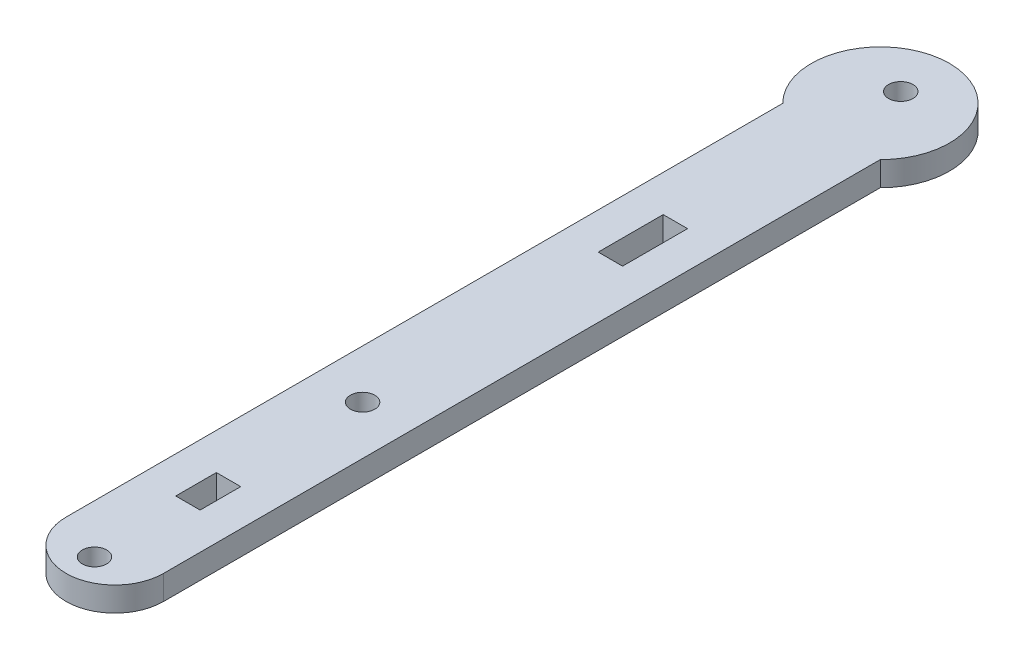
ISO-10303-21;
HEADER;
FILE_DESCRIPTION(('STEP AP214'),'2;1');
FILE_NAME('part.step','',(''),(''),'','','');
FILE_SCHEMA(('AUTOMOTIVE_DESIGN { 1 0 10303 214 1 1 1 1 }'));
ENDSEC;
DATA;
#1=APPLICATION_CONTEXT('core data for automotive mechanical design processes');
#2=APPLICATION_PROTOCOL_DEFINITION('international standard','automotive_design',2000,#1);
#3=PRODUCT_CONTEXT('',#1,'mechanical');
#4=PRODUCT('Part','Part','',(#3));
#5=PRODUCT_RELATED_PRODUCT_CATEGORY('part','',(#4));
#6=PRODUCT_DEFINITION_FORMATION('','',#4);
#7=PRODUCT_DEFINITION_CONTEXT('part definition',#1,'design');
#8=PRODUCT_DEFINITION('design','',#6,#7);
#9=PRODUCT_DEFINITION_SHAPE('','',#8);
#10=(LENGTH_UNIT() NAMED_UNIT(*) SI_UNIT(.MILLI.,.METRE.));
#11=(NAMED_UNIT(*) PLANE_ANGLE_UNIT() SI_UNIT($,.RADIAN.));
#12=(NAMED_UNIT(*) SI_UNIT($,.STERADIAN.) SOLID_ANGLE_UNIT());
#13=UNCERTAINTY_MEASURE_WITH_UNIT(LENGTH_MEASURE(1.E-05),#10,'distance_accuracy_value','');
#14=(GEOMETRIC_REPRESENTATION_CONTEXT(3) GLOBAL_UNCERTAINTY_ASSIGNED_CONTEXT((#13)) GLOBAL_UNIT_ASSIGNED_CONTEXT((#10,
#11,#12)) REPRESENTATION_CONTEXT('',''));
#15=CARTESIAN_POINT('',(0.,0.,0.));
#16=DIRECTION('',(0.,0.,1.));
#17=DIRECTION('',(1.,0.,0.));
#18=AXIS2_PLACEMENT_3D('',#15,#16,#17);
#19=CARTESIAN_POINT('',(41801.1732579615,-384.569309846236,49.8701856440254));
#20=DIRECTION('',(0.,1.,0.));
#21=DIRECTION('',(1.,0.,0.));
#22=AXIS2_PLACEMENT_3D('',#19,#20,#21);
#23=PLANE('',#22);
#24=CARTESIAN_POINT('',(41801.1732579615,-384.569309846236,19.3701856440254));
#25=DIRECTION('',(0.,1.,0.));
#26=DIRECTION('',(1.,0.,0.));
#27=AXIS2_PLACEMENT_3D('',#24,#25,#26);
#28=CIRCLE('',#27,1.50000000000178);
#29=CARTESIAN_POINT('',(41802.6732579615,-384.569309846236,19.3701856440254));
#30=VERTEX_POINT('',#29);
#31=EDGE_CURVE('E169',#30,#30,#28,.T.);
#32=ORIENTED_EDGE('',*,*,#31,.F.);
#33=EDGE_LOOP('',(#32));
#34=FACE_BOUND('',#33,.T.);
#35=CARTESIAN_POINT('',(41801.1732579615,-384.569309846236,49.8701856440254));
#36=DIRECTION('',(0.,1.,0.));
#37=DIRECTION('',(1.,0.,0.));
#38=AXIS2_PLACEMENT_3D('',#35,#36,#37);
#39=CIRCLE('',#38,6.00000000000023);
#40=CARTESIAN_POINT('',(41795.1732579615,-384.569309846236,49.8701856440254));
#41=VERTEX_POINT('',#40);
#42=CARTESIAN_POINT('',(41807.1732579615,-384.569309846236,49.8701856440254));
#43=VERTEX_POINT('',#42);
#44=EDGE_CURVE('E212',#41,#43,#39,.T.);
#45=ORIENTED_EDGE('',*,*,#44,.T.);
#46=DIRECTION('',(0.,0.,-1.));
#47=VECTOR('',#46,1.);
#48=CARTESIAN_POINT('',(41807.1732579615,-384.569309846236,49.8701856440254));
#49=LINE('',#48,#47);
#50=CARTESIAN_POINT('',(41807.1732579615,-384.569309846237,-38.3493883546306));
#51=VERTEX_POINT('',#50);
#52=EDGE_CURVE('E215',#43,#51,#49,.T.);
#53=ORIENTED_EDGE('',*,*,#52,.T.);
#54=CARTESIAN_POINT('',(41801.1732579615,-384.569309846237,-44.370185644026));
#55=DIRECTION('',(0.,1.,0.));
#56=DIRECTION('',(1.,0.,0.));
#57=AXIS2_PLACEMENT_3D('',#54,#55,#56);
#58=CIRCLE('',#57,8.49999999999961);
#59=CARTESIAN_POINT('',(41795.1732579615,-384.569309846237,-38.3493883546306));
#60=VERTEX_POINT('',#59);
#61=EDGE_CURVE('E218',#51,#60,#58,.T.);
#62=ORIENTED_EDGE('',*,*,#61,.T.);
#63=DIRECTION('',(0.,0.,1.));
#64=VECTOR('',#63,1.);
#65=CARTESIAN_POINT('',(41795.1732579615,-384.569309846237,-38.3493883546306));
#66=LINE('',#65,#64);
#67=EDGE_CURVE('E220',#60,#41,#66,.T.);
#68=ORIENTED_EDGE('',*,*,#67,.T.);
#69=EDGE_LOOP('',(#45,#53,#62,#68));
#70=FACE_BOUND('',#69,.T.);
#71=CARTESIAN_POINT('',(41801.1732579615,-384.569309846237,-46.8701856440296));
#72=DIRECTION('',(0.,1.,0.));
#73=DIRECTION('',(1.,0.,0.));
#74=AXIS2_PLACEMENT_3D('',#71,#72,#73);
#75=CIRCLE('',#74,1.50000000000178);
#76=CARTESIAN_POINT('',(41802.6732579615,-384.569309846237,-46.8701856440296));
#77=VERTEX_POINT('',#76);
#78=EDGE_CURVE('E206',#77,#77,#75,.T.);
#79=ORIENTED_EDGE('',*,*,#78,.F.);
#80=EDGE_LOOP('',(#79));
#81=FACE_BOUND('',#80,.T.);
#82=DIRECTION('',(1.,0.,0.));
#83=VECTOR('',#82,1.);
#84=CARTESIAN_POINT('',(41799.6732579615,-384.569309846237,-11.1298143559746));
#85=LINE('',#84,#83);
#86=CARTESIAN_POINT('',(41799.6732579615,-384.569309846237,-11.1298143559746));
#87=VERTEX_POINT('',#86);
#88=CARTESIAN_POINT('',(41802.6732579615,-384.569309846237,-11.1298143559746));
#89=VERTEX_POINT('',#88);
#90=EDGE_CURVE('E177',#87,#89,#85,.T.);
#91=ORIENTED_EDGE('',*,*,#90,.F.);
#92=DIRECTION('',(0.,0.,1.));
#93=VECTOR('',#92,1.);
#94=CARTESIAN_POINT('',(41799.6732579615,-384.569309846237,-19.1298143557199));
#95=LINE('',#94,#93);
#96=CARTESIAN_POINT('',(41799.6732579615,-384.569309846237,-19.1298143557199));
#97=VERTEX_POINT('',#96);
#98=EDGE_CURVE('E175',#97,#87,#95,.T.);
#99=ORIENTED_EDGE('',*,*,#98,.F.);
#100=DIRECTION('',(-1.,0.,0.));
#101=VECTOR('',#100,1.);
#102=CARTESIAN_POINT('',(41799.6732579615,-384.569309846237,-19.1298143557199));
#103=LINE('',#102,#101);
#104=CARTESIAN_POINT('',(41802.6732579615,-384.569309846237,-19.1298143557199));
#105=VERTEX_POINT('',#104);
#106=EDGE_CURVE('E183',#105,#97,#103,.T.);
#107=ORIENTED_EDGE('',*,*,#106,.F.);
#108=DIRECTION('',(0.,0.,-1.));
#109=VECTOR('',#108,1.);
#110=CARTESIAN_POINT('',(41802.6732579615,-384.569309846237,-19.1298143557199));
#111=LINE('',#110,#109);
#112=EDGE_CURVE('E180',#89,#105,#111,.T.);
#113=ORIENTED_EDGE('',*,*,#112,.F.);
#114=EDGE_LOOP('',(#91,#99,#107,#113));
#115=FACE_BOUND('',#114,.T.);
#116=CARTESIAN_POINT('',(41801.1732579615,-384.569309846236,52.3701856440254));
#117=DIRECTION('',(0.,1.,0.));
#118=DIRECTION('',(1.,0.,0.));
#119=AXIS2_PLACEMENT_3D('',#116,#117,#118);
#120=CIRCLE('',#119,1.50000000000178);
#121=CARTESIAN_POINT('',(41802.6732579615,-384.569309846236,52.3701856440254));
#122=VERTEX_POINT('',#121);
#123=EDGE_CURVE('E163',#122,#122,#120,.T.);
#124=ORIENTED_EDGE('',*,*,#123,.F.);
#125=EDGE_LOOP('',(#124));
#126=FACE_BOUND('',#125,.T.);
#127=DIRECTION('',(1.,0.,0.));
#128=VECTOR('',#127,1.);
#129=CARTESIAN_POINT('',(41799.6732579615,-384.569309846236,40.8701856440254));
#130=LINE('',#129,#128);
#131=CARTESIAN_POINT('',(41799.6732579615,-384.569309846236,40.8701856440254));
#132=VERTEX_POINT('',#131);
#133=CARTESIAN_POINT('',(41802.6732579615,-384.569309846236,40.8701856440254));
#134=VERTEX_POINT('',#133);
#135=EDGE_CURVE('E135',#132,#134,#130,.T.);
#136=ORIENTED_EDGE('',*,*,#135,.F.);
#137=DIRECTION('',(0.,0.,1.));
#138=VECTOR('',#137,1.);
#139=CARTESIAN_POINT('',(41799.6732579615,-384.569309846236,35.8701856440254));
#140=LINE('',#139,#138);
#141=CARTESIAN_POINT('',(41799.6732579615,-384.569309846236,35.8701856440254));
#142=VERTEX_POINT('',#141);
#143=EDGE_CURVE('E127',#142,#132,#140,.T.);
#144=ORIENTED_EDGE('',*,*,#143,.F.);
#145=DIRECTION('',(-1.,0.,0.));
#146=VECTOR('',#145,1.);
#147=CARTESIAN_POINT('',(41799.6732579615,-384.569309846236,35.8701856440254));
#148=LINE('',#147,#146);
#149=CARTESIAN_POINT('',(41802.6732579615,-384.569309846236,35.8701856440254));
#150=VERTEX_POINT('',#149);
#151=EDGE_CURVE('E149',#150,#142,#148,.T.);
#152=ORIENTED_EDGE('',*,*,#151,.F.);
#153=DIRECTION('',(0.,0.,-1.));
#154=VECTOR('',#153,1.);
#155=CARTESIAN_POINT('',(41802.6732579615,-384.569309846236,35.8701856440254));
#156=LINE('',#155,#154);
#157=EDGE_CURVE('E147',#134,#150,#156,.T.);
#158=ORIENTED_EDGE('',*,*,#157,.F.);
#159=EDGE_LOOP('',(#136,#144,#152,#158));
#160=FACE_BOUND('',#159,.T.);
#161=ADVANCED_FACE('F38',(#34,#70,#81,#115,#126,#160),#23,.T.);
#162=CARTESIAN_POINT('',(41801.1732579615,-387.569309846236,49.8701856440254));
#163=DIRECTION('',(0.,1.,0.));
#164=DIRECTION('',(1.,0.,0.));
#165=AXIS2_PLACEMENT_3D('',#162,#163,#164);
#166=PLANE('',#165);
#167=CARTESIAN_POINT('',(41801.1732579615,-387.569309846236,52.3701856440254));
#168=DIRECTION('',(0.,1.,0.));
#169=DIRECTION('',(1.,0.,0.));
#170=AXIS2_PLACEMENT_3D('',#167,#168,#169);
#171=CIRCLE('',#170,1.50000000000178);
#172=CARTESIAN_POINT('',(41802.6732579615,-387.569309846236,52.3701856440254));
#173=VERTEX_POINT('',#172);
#174=EDGE_CURVE('E143',#173,#173,#171,.T.);
#175=ORIENTED_EDGE('',*,*,#174,.T.);
#176=EDGE_LOOP('',(#175));
#177=FACE_BOUND('',#176,.T.);
#178=CARTESIAN_POINT('',(41801.1732579615,-387.569309846236,19.3701856440254));
#179=DIRECTION('',(0.,1.,0.));
#180=DIRECTION('',(1.,0.,0.));
#181=AXIS2_PLACEMENT_3D('',#178,#179,#180);
#182=CIRCLE('',#181,1.50000000000178);
#183=CARTESIAN_POINT('',(41802.6732579615,-387.569309846236,19.3701856440254));
#184=VERTEX_POINT('',#183);
#185=EDGE_CURVE('E166',#184,#184,#182,.T.);
#186=ORIENTED_EDGE('',*,*,#185,.T.);
#187=EDGE_LOOP('',(#186));
#188=FACE_BOUND('',#187,.T.);
#189=DIRECTION('',(0.,0.,1.));
#190=VECTOR('',#189,1.);
#191=CARTESIAN_POINT('',(41799.6732579615,-387.569309846237,-19.1298143557199));
#192=LINE('',#191,#190);
#193=CARTESIAN_POINT('',(41799.6732579615,-387.569309846237,-19.1298143557199));
#194=VERTEX_POINT('',#193);
#195=CARTESIAN_POINT('',(41799.6732579615,-387.569309846237,-11.1298143559746));
#196=VERTEX_POINT('',#195);
#197=EDGE_CURVE('E172',#194,#196,#192,.T.);
#198=ORIENTED_EDGE('',*,*,#197,.T.);
#199=DIRECTION('',(1.,0.,0.));
#200=VECTOR('',#199,1.);
#201=CARTESIAN_POINT('',(41799.6732579615,-387.569309846237,-11.1298143559746));
#202=LINE('',#201,#200);
#203=CARTESIAN_POINT('',(41802.6732579615,-387.569309846237,-11.1298143559746));
#204=VERTEX_POINT('',#203);
#205=EDGE_CURVE('E188',#196,#204,#202,.T.);
#206=ORIENTED_EDGE('',*,*,#205,.T.);
#207=DIRECTION('',(0.,0.,-1.));
#208=VECTOR('',#207,1.);
#209=CARTESIAN_POINT('',(41802.6732579615,-387.569309846237,-19.1298143557199));
#210=LINE('',#209,#208);
#211=CARTESIAN_POINT('',(41802.6732579615,-387.569309846237,-19.1298143557199));
#212=VERTEX_POINT('',#211);
#213=EDGE_CURVE('E191',#204,#212,#210,.T.);
#214=ORIENTED_EDGE('',*,*,#213,.T.);
#215=DIRECTION('',(-1.,0.,0.));
#216=VECTOR('',#215,1.);
#217=CARTESIAN_POINT('',(41799.6732579615,-387.569309846237,-19.1298143557199));
#218=LINE('',#217,#216);
#219=EDGE_CURVE('E178',#212,#194,#218,.T.);
#220=ORIENTED_EDGE('',*,*,#219,.T.);
#221=EDGE_LOOP('',(#198,#206,#214,#220));
#222=FACE_BOUND('',#221,.T.);
#223=CARTESIAN_POINT('',(41801.1732579615,-387.569309846236,49.8701856440254));
#224=DIRECTION('',(0.,1.,0.));
#225=DIRECTION('',(1.,0.,0.));
#226=AXIS2_PLACEMENT_3D('',#223,#224,#225);
#227=CIRCLE('',#226,6.00000000000023);
#228=CARTESIAN_POINT('',(41795.1732579615,-387.569309846236,49.8701856440254));
#229=VERTEX_POINT('',#228);
#230=CARTESIAN_POINT('',(41807.1732579615,-387.569309846236,49.8701856440254));
#231=VERTEX_POINT('',#230);
#232=EDGE_CURVE('E209',#229,#231,#227,.T.);
#233=ORIENTED_EDGE('',*,*,#232,.F.);
#234=DIRECTION('',(0.,0.,1.));
#235=VECTOR('',#234,1.);
#236=CARTESIAN_POINT('',(41795.1732579615,-387.569309846237,-38.3493883546306));
#237=LINE('',#236,#235);
#238=CARTESIAN_POINT('',(41795.1732579615,-387.569309846237,-38.3493883546306));
#239=VERTEX_POINT('',#238);
#240=EDGE_CURVE('E216',#239,#229,#237,.T.);
#241=ORIENTED_EDGE('',*,*,#240,.F.);
#242=CARTESIAN_POINT('',(41801.1732579615,-387.569309846237,-44.370185644026));
#243=DIRECTION('',(0.,1.,0.));
#244=DIRECTION('',(1.,0.,0.));
#245=AXIS2_PLACEMENT_3D('',#242,#243,#244);
#246=CIRCLE('',#245,8.49999999999961);
#247=CARTESIAN_POINT('',(41807.1732579615,-387.569309846237,-38.3493883546306));
#248=VERTEX_POINT('',#247);
#249=EDGE_CURVE('E227',#248,#239,#246,.T.);
#250=ORIENTED_EDGE('',*,*,#249,.F.);
#251=DIRECTION('',(0.,0.,-1.));
#252=VECTOR('',#251,1.);
#253=CARTESIAN_POINT('',(41807.1732579615,-387.569309846236,49.8701856440254));
#254=LINE('',#253,#252);
#255=EDGE_CURVE('E225',#231,#248,#254,.T.);
#256=ORIENTED_EDGE('',*,*,#255,.F.);
#257=EDGE_LOOP('',(#233,#241,#250,#256));
#258=FACE_BOUND('',#257,.T.);
#259=CARTESIAN_POINT('',(41801.1732579615,-387.569309846237,-46.8701856440296));
#260=DIRECTION('',(0.,1.,0.));
#261=DIRECTION('',(1.,0.,0.));
#262=AXIS2_PLACEMENT_3D('',#259,#260,#261);
#263=CIRCLE('',#262,1.50000000000178);
#264=CARTESIAN_POINT('',(41802.6732579615,-387.569309846237,-46.8701856440296));
#265=VERTEX_POINT('',#264);
#266=EDGE_CURVE('E205',#265,#265,#263,.T.);
#267=ORIENTED_EDGE('',*,*,#266,.T.);
#268=EDGE_LOOP('',(#267));
#269=FACE_BOUND('',#268,.T.);
#270=DIRECTION('',(0.,0.,1.));
#271=VECTOR('',#270,1.);
#272=CARTESIAN_POINT('',(41799.6732579615,-387.569309846236,35.8701856440254));
#273=LINE('',#272,#271);
#274=CARTESIAN_POINT('',(41799.6732579615,-387.569309846236,35.8701856440254));
#275=VERTEX_POINT('',#274);
#276=CARTESIAN_POINT('',(41799.6732579615,-387.569309846236,40.8701856440254));
#277=VERTEX_POINT('',#276);
#278=EDGE_CURVE('E61',#275,#277,#273,.T.);
#279=ORIENTED_EDGE('',*,*,#278,.T.);
#280=DIRECTION('',(1.,0.,0.));
#281=VECTOR('',#280,1.);
#282=CARTESIAN_POINT('',(41799.6732579615,-387.569309846236,40.8701856440254));
#283=LINE('',#282,#281);
#284=CARTESIAN_POINT('',(41802.6732579615,-387.569309846236,40.8701856440254));
#285=VERTEX_POINT('',#284);
#286=EDGE_CURVE('E142',#277,#285,#283,.T.);
#287=ORIENTED_EDGE('',*,*,#286,.T.);
#288=DIRECTION('',(0.,0.,-1.));
#289=VECTOR('',#288,1.);
#290=CARTESIAN_POINT('',(41802.6732579615,-387.569309846236,35.8701856440254));
#291=LINE('',#290,#289);
#292=CARTESIAN_POINT('',(41802.6732579615,-387.569309846236,35.8701856440254));
#293=VERTEX_POINT('',#292);
#294=EDGE_CURVE('E155',#285,#293,#291,.T.);
#295=ORIENTED_EDGE('',*,*,#294,.T.);
#296=DIRECTION('',(-1.,0.,0.));
#297=VECTOR('',#296,1.);
#298=CARTESIAN_POINT('',(41799.6732579615,-387.569309846236,35.8701856440254));
#299=LINE('',#298,#297);
#300=EDGE_CURVE('E136',#293,#275,#299,.T.);
#301=ORIENTED_EDGE('',*,*,#300,.T.);
#302=EDGE_LOOP('',(#279,#287,#295,#301));
#303=FACE_BOUND('',#302,.T.);
#304=ADVANCED_FACE('F245',(#177,#188,#222,#258,#269,#303),#166,.F.);
#305=CARTESIAN_POINT('',(41801.1732579615,-384.569309846236,49.8701856440254));
#306=DIRECTION('',(0.,-1.,0.));
#307=DIRECTION('',(-1.,0.,0.));
#308=AXIS2_PLACEMENT_3D('',#305,#306,#307);
#309=CYLINDRICAL_SURFACE('',#308,6.00000000000023);
#310=ORIENTED_EDGE('',*,*,#232,.T.);
#311=DIRECTION('',(0.,-1.,0.));
#312=VECTOR('',#311,1.);
#313=CARTESIAN_POINT('',(41807.1732579615,-384.569309846236,49.8701856440254));
#314=LINE('',#313,#312);
#315=EDGE_CURVE('E11',#43,#231,#314,.T.);
#316=ORIENTED_EDGE('',*,*,#315,.F.);
#317=ORIENTED_EDGE('',*,*,#44,.F.);
#318=DIRECTION('',(0.,-1.,0.));
#319=VECTOR('',#318,1.);
#320=CARTESIAN_POINT('',(41795.1732579615,-384.569309846236,49.8701856440254));
#321=LINE('',#320,#319);
#322=EDGE_CURVE('E222',#41,#229,#321,.T.);
#323=ORIENTED_EDGE('',*,*,#322,.T.);
#324=EDGE_LOOP('',(#310,#316,#317,#323));
#325=FACE_BOUND('',#324,.T.);
#326=ADVANCED_FACE('F40',(#325),#309,.T.);
#327=CARTESIAN_POINT('',(41807.1732579615,-384.569309846236,49.8701856440254));
#328=DIRECTION('',(-1.,0.,0.));
#329=DIRECTION('',(0.,1.,0.));
#330=AXIS2_PLACEMENT_3D('',#327,#328,#329);
#331=PLANE('',#330);
#332=ORIENTED_EDGE('',*,*,#255,.T.);
#333=DIRECTION('',(0.,-1.,0.));
#334=VECTOR('',#333,1.);
#335=CARTESIAN_POINT('',(41807.1732579615,-384.569309846237,-38.3493883546306));
#336=LINE('',#335,#334);
#337=EDGE_CURVE('E46',#51,#248,#336,.T.);
#338=ORIENTED_EDGE('',*,*,#337,.F.);
#339=ORIENTED_EDGE('',*,*,#52,.F.);
#340=ORIENTED_EDGE('',*,*,#315,.T.);
#341=EDGE_LOOP('',(#332,#338,#339,#340));
#342=FACE_BOUND('',#341,.T.);
#343=ADVANCED_FACE('F256',(#342),#331,.F.);
#344=CARTESIAN_POINT('',(41801.1732579615,-384.569309846237,-44.370185644026));
#345=DIRECTION('',(0.,-1.,0.));
#346=DIRECTION('',(-1.,0.,0.));
#347=AXIS2_PLACEMENT_3D('',#344,#345,#346);
#348=CYLINDRICAL_SURFACE('',#347,8.49999999999961);
#349=ORIENTED_EDGE('',*,*,#249,.T.);
#350=DIRECTION('',(0.,-1.,0.));
#351=VECTOR('',#350,1.);
#352=CARTESIAN_POINT('',(41795.1732579615,-384.569309846237,-38.3493883546306));
#353=LINE('',#352,#351);
#354=EDGE_CURVE('E232',#60,#239,#353,.T.);
#355=ORIENTED_EDGE('',*,*,#354,.F.);
#356=ORIENTED_EDGE('',*,*,#61,.F.);
#357=ORIENTED_EDGE('',*,*,#337,.T.);
#358=EDGE_LOOP('',(#349,#355,#356,#357));
#359=FACE_BOUND('',#358,.T.);
#360=ADVANCED_FACE('F239',(#359),#348,.T.);
#361=CARTESIAN_POINT('',(41795.1732579615,-384.569309846237,-38.3493883546306));
#362=DIRECTION('',(1.,0.,0.));
#363=DIRECTION('',(0.,-1.,0.));
#364=AXIS2_PLACEMENT_3D('',#361,#362,#363);
#365=PLANE('',#364);
#366=ORIENTED_EDGE('',*,*,#240,.T.);
#367=ORIENTED_EDGE('',*,*,#322,.F.);
#368=ORIENTED_EDGE('',*,*,#67,.F.);
#369=ORIENTED_EDGE('',*,*,#354,.T.);
#370=EDGE_LOOP('',(#366,#367,#368,#369));
#371=FACE_BOUND('',#370,.T.);
#372=ADVANCED_FACE('F249',(#371),#365,.F.);
#373=CARTESIAN_POINT('',(41801.1732579615,-384.569309846237,-46.8701856440296));
#374=DIRECTION('',(0.,-1.,0.));
#375=DIRECTION('',(-1.,0.,0.));
#376=AXIS2_PLACEMENT_3D('',#373,#374,#375);
#377=CYLINDRICAL_SURFACE('',#376,1.50000000000178);
#378=ORIENTED_EDGE('',*,*,#78,.T.);
#379=EDGE_LOOP('',(#378));
#380=FACE_BOUND('',#379,.T.);
#381=ORIENTED_EDGE('',*,*,#266,.F.);
#382=EDGE_LOOP('',(#381));
#383=FACE_BOUND('',#382,.T.);
#384=ADVANCED_FACE('F273',(#380,#383),#377,.F.);
#385=CARTESIAN_POINT('',(41799.6732579615,-384.569309846237,-19.1298143557199));
#386=DIRECTION('',(1.,0.,0.));
#387=DIRECTION('',(0.,-1.,0.));
#388=AXIS2_PLACEMENT_3D('',#385,#386,#387);
#389=PLANE('',#388);
#390=ORIENTED_EDGE('',*,*,#197,.F.);
#391=DIRECTION('',(0.,-1.,0.));
#392=VECTOR('',#391,1.);
#393=CARTESIAN_POINT('',(41799.6732579615,-384.569309846237,-19.1298143557199));
#394=LINE('',#393,#392);
#395=EDGE_CURVE('E185',#97,#194,#394,.T.);
#396=ORIENTED_EDGE('',*,*,#395,.F.);
#397=ORIENTED_EDGE('',*,*,#98,.T.);
#398=DIRECTION('',(0.,-1.,0.));
#399=VECTOR('',#398,1.);
#400=CARTESIAN_POINT('',(41799.6732579615,-384.569309846237,-11.1298143559746));
#401=LINE('',#400,#399);
#402=EDGE_CURVE('E202',#87,#196,#401,.T.);
#403=ORIENTED_EDGE('',*,*,#402,.T.);
#404=EDGE_LOOP('',(#390,#396,#397,#403));
#405=FACE_BOUND('',#404,.T.);
#406=ADVANCED_FACE('F280',(#405),#389,.T.);
#407=CARTESIAN_POINT('',(41799.6732579615,-384.569309846237,-11.1298143559746));
#408=DIRECTION('',(0.,0.,-1.));
#409=DIRECTION('',(0.,1.,0.));
#410=AXIS2_PLACEMENT_3D('',#407,#408,#409);
#411=PLANE('',#410);
#412=ORIENTED_EDGE('',*,*,#205,.F.);
#413=ORIENTED_EDGE('',*,*,#402,.F.);
#414=ORIENTED_EDGE('',*,*,#90,.T.);
#415=DIRECTION('',(0.,-1.,0.));
#416=VECTOR('',#415,1.);
#417=CARTESIAN_POINT('',(41802.6732579615,-384.569309846237,-11.1298143559746));
#418=LINE('',#417,#416);
#419=EDGE_CURVE('E200',#89,#204,#418,.T.);
#420=ORIENTED_EDGE('',*,*,#419,.T.);
#421=EDGE_LOOP('',(#412,#413,#414,#420));
#422=FACE_BOUND('',#421,.T.);
#423=ADVANCED_FACE('F285',(#422),#411,.T.);
#424=CARTESIAN_POINT('',(41802.6732579615,-384.569309846237,-19.1298143557199));
#425=DIRECTION('',(-1.,0.,0.));
#426=DIRECTION('',(0.,1.,0.));
#427=AXIS2_PLACEMENT_3D('',#424,#425,#426);
#428=PLANE('',#427);
#429=ORIENTED_EDGE('',*,*,#213,.F.);
#430=ORIENTED_EDGE('',*,*,#419,.F.);
#431=ORIENTED_EDGE('',*,*,#112,.T.);
#432=DIRECTION('',(0.,-1.,0.));
#433=VECTOR('',#432,1.);
#434=CARTESIAN_POINT('',(41802.6732579615,-384.569309846237,-19.1298143557199));
#435=LINE('',#434,#433);
#436=EDGE_CURVE('E198',#105,#212,#435,.T.);
#437=ORIENTED_EDGE('',*,*,#436,.T.);
#438=EDGE_LOOP('',(#429,#430,#431,#437));
#439=FACE_BOUND('',#438,.T.);
#440=ADVANCED_FACE('F317',(#439),#428,.T.);
#441=CARTESIAN_POINT('',(41799.6732579615,-384.569309846237,-19.1298143557199));
#442=DIRECTION('',(0.,0.,1.));
#443=DIRECTION('',(0.,-1.,0.));
#444=AXIS2_PLACEMENT_3D('',#441,#442,#443);
#445=PLANE('',#444);
#446=ORIENTED_EDGE('',*,*,#219,.F.);
#447=ORIENTED_EDGE('',*,*,#436,.F.);
#448=ORIENTED_EDGE('',*,*,#106,.T.);
#449=ORIENTED_EDGE('',*,*,#395,.T.);
#450=EDGE_LOOP('',(#446,#447,#448,#449));
#451=FACE_BOUND('',#450,.T.);
#452=ADVANCED_FACE('F313',(#451),#445,.T.);
#453=CARTESIAN_POINT('',(41801.1732579615,-384.569309846236,19.3701856440254));
#454=DIRECTION('',(0.,-1.,0.));
#455=DIRECTION('',(-1.,0.,0.));
#456=AXIS2_PLACEMENT_3D('',#453,#454,#455);
#457=CYLINDRICAL_SURFACE('',#456,1.50000000000178);
#458=ORIENTED_EDGE('',*,*,#31,.T.);
#459=EDGE_LOOP('',(#458));
#460=FACE_BOUND('',#459,.T.);
#461=ORIENTED_EDGE('',*,*,#185,.F.);
#462=EDGE_LOOP('',(#461));
#463=FACE_BOUND('',#462,.T.);
#464=ADVANCED_FACE('F309',(#460,#463),#457,.F.);
#465=CARTESIAN_POINT('',(41801.1732579615,-384.569309846236,52.3701856440254));
#466=DIRECTION('',(0.,-1.,0.));
#467=DIRECTION('',(-1.,0.,0.));
#468=AXIS2_PLACEMENT_3D('',#465,#466,#467);
#469=CYLINDRICAL_SURFACE('',#468,1.50000000000178);
#470=ORIENTED_EDGE('',*,*,#123,.T.);
#471=EDGE_LOOP('',(#470));
#472=FACE_BOUND('',#471,.T.);
#473=ORIENTED_EDGE('',*,*,#174,.F.);
#474=EDGE_LOOP('',(#473));
#475=FACE_BOUND('',#474,.T.);
#476=ADVANCED_FACE('F306',(#472,#475),#469,.F.);
#477=CARTESIAN_POINT('',(41799.6732579615,-384.569309846236,35.8701856440254));
#478=DIRECTION('',(1.,0.,0.));
#479=DIRECTION('',(0.,-1.,0.));
#480=AXIS2_PLACEMENT_3D('',#477,#478,#479);
#481=PLANE('',#480);
#482=ORIENTED_EDGE('',*,*,#278,.F.);
#483=DIRECTION('',(0.,-1.,0.));
#484=VECTOR('',#483,1.);
#485=CARTESIAN_POINT('',(41799.6732579615,-384.569309846236,35.8701856440254));
#486=LINE('',#485,#484);
#487=EDGE_CURVE('E131',#142,#275,#486,.T.);
#488=ORIENTED_EDGE('',*,*,#487,.F.);
#489=ORIENTED_EDGE('',*,*,#143,.T.);
#490=DIRECTION('',(0.,-1.,0.));
#491=VECTOR('',#490,1.);
#492=CARTESIAN_POINT('',(41799.6732579615,-384.569309846236,40.8701856440254));
#493=LINE('',#492,#491);
#494=EDGE_CURVE('E130',#132,#277,#493,.T.);
#495=ORIENTED_EDGE('',*,*,#494,.T.);
#496=EDGE_LOOP('',(#482,#488,#489,#495));
#497=FACE_BOUND('',#496,.T.);
#498=ADVANCED_FACE('F129',(#497),#481,.T.);
#499=CARTESIAN_POINT('',(41799.6732579615,-384.569309846236,40.8701856440254));
#500=DIRECTION('',(0.,0.,-1.));
#501=DIRECTION('',(0.,1.,0.));
#502=AXIS2_PLACEMENT_3D('',#499,#500,#501);
#503=PLANE('',#502);
#504=ORIENTED_EDGE('',*,*,#286,.F.);
#505=ORIENTED_EDGE('',*,*,#494,.F.);
#506=ORIENTED_EDGE('',*,*,#135,.T.);
#507=DIRECTION('',(0.,-1.,0.));
#508=VECTOR('',#507,1.);
#509=CARTESIAN_POINT('',(41802.6732579615,-384.569309846236,40.8701856440254));
#510=LINE('',#509,#508);
#511=EDGE_CURVE('E144',#134,#285,#510,.T.);
#512=ORIENTED_EDGE('',*,*,#511,.T.);
#513=EDGE_LOOP('',(#504,#505,#506,#512));
#514=FACE_BOUND('',#513,.T.);
#515=ADVANCED_FACE('F139',(#514),#503,.T.);
#516=CARTESIAN_POINT('',(41802.6732579615,-384.569309846236,35.8701856440254));
#517=DIRECTION('',(-1.,0.,0.));
#518=DIRECTION('',(0.,1.,0.));
#519=AXIS2_PLACEMENT_3D('',#516,#517,#518);
#520=PLANE('',#519);
#521=ORIENTED_EDGE('',*,*,#294,.F.);
#522=ORIENTED_EDGE('',*,*,#511,.F.);
#523=ORIENTED_EDGE('',*,*,#157,.T.);
#524=DIRECTION('',(0.,-1.,0.));
#525=VECTOR('',#524,1.);
#526=CARTESIAN_POINT('',(41802.6732579615,-384.569309846236,35.8701856440254));
#527=LINE('',#526,#525);
#528=EDGE_CURVE('E53',#150,#293,#527,.T.);
#529=ORIENTED_EDGE('',*,*,#528,.T.);
#530=EDGE_LOOP('',(#521,#522,#523,#529));
#531=FACE_BOUND('',#530,.T.);
#532=ADVANCED_FACE('F294',(#531),#520,.T.);
#533=CARTESIAN_POINT('',(41799.6732579615,-384.569309846236,35.8701856440254));
#534=DIRECTION('',(0.,0.,1.));
#535=DIRECTION('',(0.,-1.,0.));
#536=AXIS2_PLACEMENT_3D('',#533,#534,#535);
#537=PLANE('',#536);
#538=ORIENTED_EDGE('',*,*,#300,.F.);
#539=ORIENTED_EDGE('',*,*,#528,.F.);
#540=ORIENTED_EDGE('',*,*,#151,.T.);
#541=ORIENTED_EDGE('',*,*,#487,.T.);
#542=EDGE_LOOP('',(#538,#539,#540,#541));
#543=FACE_BOUND('',#542,.T.);
#544=ADVANCED_FACE('F292',(#543),#537,.T.);
#545=CLOSED_SHELL('',(#161,#304,#326,#343,#360,#372,#384,#406,#423,#440,#452,#464,#476,#498,
#515,#532,#544));
#546=MANIFOLD_SOLID_BREP('B2',#545);
#547=ADVANCED_BREP_SHAPE_REPRESENTATION('',(#18,#546),#14);
#548=SHAPE_DEFINITION_REPRESENTATION(#9,#547);
ENDSEC;
END-ISO-10303-21;
